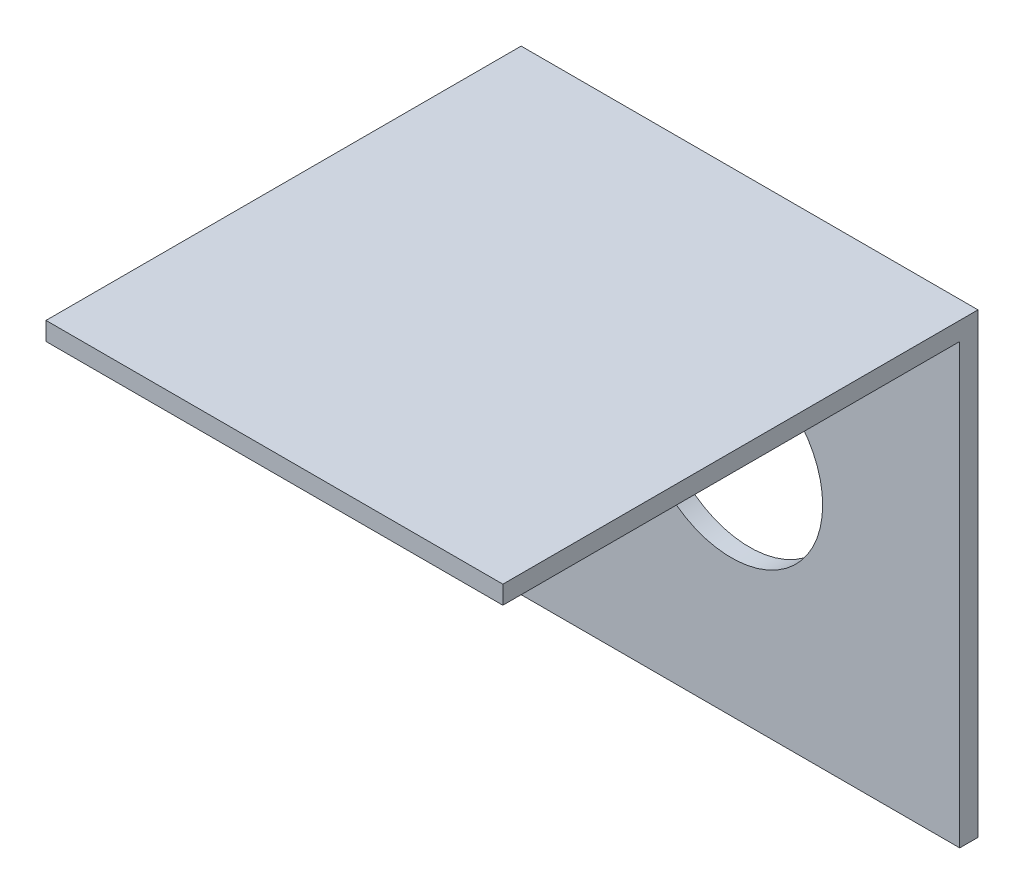
ISO-10303-21;
HEADER;
FILE_DESCRIPTION(('STEP AP214'),'2;1');
FILE_NAME('part.step','',(''),(''),'','','');
FILE_SCHEMA(('AUTOMOTIVE_DESIGN { 1 0 10303 214 1 1 1 1 }'));
ENDSEC;
DATA;
#1=APPLICATION_CONTEXT('core data for automotive mechanical design processes');
#2=APPLICATION_PROTOCOL_DEFINITION('international standard','automotive_design',2000,#1);
#3=PRODUCT_CONTEXT('',#1,'mechanical');
#4=PRODUCT('Part','Part','',(#3));
#5=PRODUCT_RELATED_PRODUCT_CATEGORY('part','',(#4));
#6=PRODUCT_DEFINITION_FORMATION('','',#4);
#7=PRODUCT_DEFINITION_CONTEXT('part definition',#1,'design');
#8=PRODUCT_DEFINITION('design','',#6,#7);
#9=PRODUCT_DEFINITION_SHAPE('','',#8);
#10=(LENGTH_UNIT() NAMED_UNIT(*) SI_UNIT(.MILLI.,.METRE.));
#11=(NAMED_UNIT(*) PLANE_ANGLE_UNIT() SI_UNIT($,.RADIAN.));
#12=(NAMED_UNIT(*) SI_UNIT($,.STERADIAN.) SOLID_ANGLE_UNIT());
#13=UNCERTAINTY_MEASURE_WITH_UNIT(LENGTH_MEASURE(1.E-05),#10,'distance_accuracy_value','');
#14=(GEOMETRIC_REPRESENTATION_CONTEXT(3) GLOBAL_UNCERTAINTY_ASSIGNED_CONTEXT((#13)) GLOBAL_UNIT_ASSIGNED_CONTEXT((#10,
#11,#12)) REPRESENTATION_CONTEXT('',''));
#15=CARTESIAN_POINT('',(0.,0.,0.));
#16=DIRECTION('',(0.,0.,1.));
#17=DIRECTION('',(1.,0.,0.));
#18=AXIS2_PLACEMENT_3D('',#15,#16,#17);
#19=CARTESIAN_POINT('',(0.,0.,2.));
#20=DIRECTION('',(0.,0.,-1.));
#21=DIRECTION('',(-1.,0.,0.));
#22=AXIS2_PLACEMENT_3D('',#19,#20,#21);
#23=PLANE('',#22);
#24=CARTESIAN_POINT('',(0.,0.,2.));
#25=DIRECTION('',(0.,0.,-1.));
#26=DIRECTION('',(-1.,0.,0.));
#27=AXIS2_PLACEMENT_3D('',#24,#25,#26);
#28=CIRCLE('',#27,10.);
#29=CARTESIAN_POINT('',(-10.,0.,2.));
#30=VERTEX_POINT('',#29);
#31=EDGE_CURVE('E136',#30,#30,#28,.T.);
#32=ORIENTED_EDGE('',*,*,#31,.T.);
#33=EDGE_LOOP('',(#32));
#34=FACE_BOUND('',#33,.T.);
#35=DIRECTION('',(1.,0.,0.));
#36=VECTOR('',#35,1.);
#37=CARTESIAN_POINT('',(-25.,23.,2.));
#38=LINE('',#37,#36);
#39=CARTESIAN_POINT('',(-25.,23.,2.));
#40=VERTEX_POINT('',#39);
#41=CARTESIAN_POINT('',(25.,23.,2.));
#42=VERTEX_POINT('',#41);
#43=EDGE_CURVE('E52',#40,#42,#38,.T.);
#44=ORIENTED_EDGE('',*,*,#43,.F.);
#45=DIRECTION('',(0.,-1.,0.));
#46=VECTOR('',#45,1.);
#47=CARTESIAN_POINT('',(-25.,-25.,2.));
#48=LINE('',#47,#46);
#49=CARTESIAN_POINT('',(-25.,-25.,2.));
#50=VERTEX_POINT('',#49);
#51=EDGE_CURVE('E138',#40,#50,#48,.T.);
#52=ORIENTED_EDGE('',*,*,#51,.T.);
#53=DIRECTION('',(1.,0.,0.));
#54=VECTOR('',#53,1.);
#55=CARTESIAN_POINT('',(-25.,-25.,2.));
#56=LINE('',#55,#54);
#57=CARTESIAN_POINT('',(25.,-25.,2.));
#58=VERTEX_POINT('',#57);
#59=EDGE_CURVE('E58',#50,#58,#56,.T.);
#60=ORIENTED_EDGE('',*,*,#59,.T.);
#61=DIRECTION('',(0.,1.,0.));
#62=VECTOR('',#61,1.);
#63=CARTESIAN_POINT('',(25.,-25.,2.));
#64=LINE('',#63,#62);
#65=EDGE_CURVE('E87',#58,#42,#64,.T.);
#66=ORIENTED_EDGE('',*,*,#65,.T.);
#67=EDGE_LOOP('',(#44,#52,#60,#66));
#68=FACE_BOUND('',#67,.T.);
#69=ADVANCED_FACE('F37',(#34,#68),#23,.F.);
#70=CARTESIAN_POINT('',(25.,-25.,2.));
#71=DIRECTION('',(-1.,0.,0.));
#72=DIRECTION('',(0.,0.,1.));
#73=AXIS2_PLACEMENT_3D('',#70,#71,#72);
#74=PLANE('',#73);
#75=DIRECTION('',(0.,1.,0.));
#76=VECTOR('',#75,1.);
#77=CARTESIAN_POINT('',(25.,-25.,0.));
#78=LINE('',#77,#76);
#79=CARTESIAN_POINT('',(25.,-25.,0.));
#80=VERTEX_POINT('',#79);
#81=CARTESIAN_POINT('',(25.,25.,0.));
#82=VERTEX_POINT('',#81);
#83=EDGE_CURVE('E93',#80,#82,#78,.T.);
#84=ORIENTED_EDGE('',*,*,#83,.T.);
#85=DIRECTION('',(0.,0.,-1.));
#86=VECTOR('',#85,1.);
#87=CARTESIAN_POINT('',(25.,25.,2.));
#88=LINE('',#87,#86);
#89=CARTESIAN_POINT('',(25.,25.,52.));
#90=VERTEX_POINT('',#89);
#91=EDGE_CURVE('E11',#90,#82,#88,.T.);
#92=ORIENTED_EDGE('',*,*,#91,.F.);
#93=DIRECTION('',(0.,1.,0.));
#94=VECTOR('',#93,1.);
#95=CARTESIAN_POINT('',(25.,25.,52.));
#96=LINE('',#95,#94);
#97=CARTESIAN_POINT('',(25.,23.,52.));
#98=VERTEX_POINT('',#97);
#99=EDGE_CURVE('E129',#98,#90,#96,.T.);
#100=ORIENTED_EDGE('',*,*,#99,.F.);
#101=DIRECTION('',(0.,0.,-1.));
#102=VECTOR('',#101,1.);
#103=CARTESIAN_POINT('',(25.,23.,52.));
#104=LINE('',#103,#102);
#105=EDGE_CURVE('E102',#98,#42,#104,.T.);
#106=ORIENTED_EDGE('',*,*,#105,.T.);
#107=ORIENTED_EDGE('',*,*,#65,.F.);
#108=DIRECTION('',(0.,0.,-1.));
#109=VECTOR('',#108,1.);
#110=CARTESIAN_POINT('',(25.,-25.,2.));
#111=LINE('',#110,#109);
#112=EDGE_CURVE('E80',#58,#80,#111,.T.);
#113=ORIENTED_EDGE('',*,*,#112,.T.);
#114=EDGE_LOOP('',(#84,#92,#100,#106,#107,#113));
#115=FACE_BOUND('',#114,.T.);
#116=ADVANCED_FACE('F39',(#115),#74,.F.);
#117=CARTESIAN_POINT('',(-25.,25.,2.));
#118=DIRECTION('',(0.,-1.,0.));
#119=DIRECTION('',(0.,0.,-1.));
#120=AXIS2_PLACEMENT_3D('',#117,#118,#119);
#121=PLANE('',#120);
#122=DIRECTION('',(-1.,0.,0.));
#123=VECTOR('',#122,1.);
#124=CARTESIAN_POINT('',(-25.,25.,0.));
#125=LINE('',#124,#123);
#126=CARTESIAN_POINT('',(-25.,25.,0.));
#127=VERTEX_POINT('',#126);
#128=EDGE_CURVE('E97',#82,#127,#125,.T.);
#129=ORIENTED_EDGE('',*,*,#128,.T.);
#130=DIRECTION('',(0.,0.,-1.));
#131=VECTOR('',#130,1.);
#132=CARTESIAN_POINT('',(-25.,25.,2.));
#133=LINE('',#132,#131);
#134=CARTESIAN_POINT('',(-25.,25.,52.));
#135=VERTEX_POINT('',#134);
#136=EDGE_CURVE('E45',#135,#127,#133,.T.);
#137=ORIENTED_EDGE('',*,*,#136,.F.);
#138=DIRECTION('',(-1.,0.,0.));
#139=VECTOR('',#138,1.);
#140=CARTESIAN_POINT('',(-25.,25.,52.));
#141=LINE('',#140,#139);
#142=EDGE_CURVE('E121',#90,#135,#141,.T.);
#143=ORIENTED_EDGE('',*,*,#142,.F.);
#144=ORIENTED_EDGE('',*,*,#91,.T.);
#145=EDGE_LOOP('',(#129,#137,#143,#144));
#146=FACE_BOUND('',#145,.T.);
#147=ADVANCED_FACE('F119',(#146),#121,.F.);
#148=CARTESIAN_POINT('',(-25.,-25.,2.));
#149=DIRECTION('',(1.,0.,0.));
#150=DIRECTION('',(0.,0.,-1.));
#151=AXIS2_PLACEMENT_3D('',#148,#149,#150);
#152=PLANE('',#151);
#153=DIRECTION('',(0.,-1.,0.));
#154=VECTOR('',#153,1.);
#155=CARTESIAN_POINT('',(-25.,-25.,0.));
#156=LINE('',#155,#154);
#157=CARTESIAN_POINT('',(-25.,-25.,0.));
#158=VERTEX_POINT('',#157);
#159=EDGE_CURVE('E88',#127,#158,#156,.T.);
#160=ORIENTED_EDGE('',*,*,#159,.T.);
#161=DIRECTION('',(0.,0.,-1.));
#162=VECTOR('',#161,1.);
#163=CARTESIAN_POINT('',(-25.,-25.,2.));
#164=LINE('',#163,#162);
#165=EDGE_CURVE('E83',#50,#158,#164,.T.);
#166=ORIENTED_EDGE('',*,*,#165,.F.);
#167=ORIENTED_EDGE('',*,*,#51,.F.);
#168=DIRECTION('',(0.,0.,-1.));
#169=VECTOR('',#168,1.);
#170=CARTESIAN_POINT('',(-25.,23.,52.));
#171=LINE('',#170,#169);
#172=CARTESIAN_POINT('',(-25.,23.,52.));
#173=VERTEX_POINT('',#172);
#174=EDGE_CURVE('E98',#173,#40,#171,.T.);
#175=ORIENTED_EDGE('',*,*,#174,.F.);
#176=DIRECTION('',(0.,-1.,0.));
#177=VECTOR('',#176,1.);
#178=CARTESIAN_POINT('',(-25.,25.,52.));
#179=LINE('',#178,#177);
#180=EDGE_CURVE('E115',#135,#173,#179,.T.);
#181=ORIENTED_EDGE('',*,*,#180,.F.);
#182=ORIENTED_EDGE('',*,*,#136,.T.);
#183=EDGE_LOOP('',(#160,#166,#167,#175,#181,#182));
#184=FACE_BOUND('',#183,.T.);
#185=ADVANCED_FACE('F112',(#184),#152,.F.);
#186=CARTESIAN_POINT('',(-25.,-25.,2.));
#187=DIRECTION('',(0.,1.,0.));
#188=DIRECTION('',(0.,0.,1.));
#189=AXIS2_PLACEMENT_3D('',#186,#187,#188);
#190=PLANE('',#189);
#191=DIRECTION('',(1.,0.,0.));
#192=VECTOR('',#191,1.);
#193=CARTESIAN_POINT('',(-25.,-25.,0.));
#194=LINE('',#193,#192);
#195=EDGE_CURVE('E77',#158,#80,#194,.T.);
#196=ORIENTED_EDGE('',*,*,#195,.T.);
#197=ORIENTED_EDGE('',*,*,#112,.F.);
#198=ORIENTED_EDGE('',*,*,#59,.F.);
#199=ORIENTED_EDGE('',*,*,#165,.T.);
#200=EDGE_LOOP('',(#196,#197,#198,#199));
#201=FACE_BOUND('',#200,.T.);
#202=ADVANCED_FACE('F79',(#201),#190,.F.);
#203=CARTESIAN_POINT('',(0.,0.,0.));
#204=DIRECTION('',(0.,0.,-1.));
#205=DIRECTION('',(-1.,0.,0.));
#206=AXIS2_PLACEMENT_3D('',#203,#204,#205);
#207=PLANE('',#206);
#208=CARTESIAN_POINT('',(0.,0.,0.));
#209=DIRECTION('',(0.,0.,-1.));
#210=DIRECTION('',(-1.,0.,0.));
#211=AXIS2_PLACEMENT_3D('',#208,#209,#210);
#212=CIRCLE('',#211,10.);
#213=CARTESIAN_POINT('',(-10.,0.,0.));
#214=VERTEX_POINT('',#213);
#215=EDGE_CURVE('E150',#214,#214,#212,.T.);
#216=ORIENTED_EDGE('',*,*,#215,.F.);
#217=EDGE_LOOP('',(#216));
#218=FACE_BOUND('',#217,.T.);
#219=ORIENTED_EDGE('',*,*,#83,.F.);
#220=ORIENTED_EDGE('',*,*,#195,.F.);
#221=ORIENTED_EDGE('',*,*,#159,.F.);
#222=ORIENTED_EDGE('',*,*,#128,.F.);
#223=EDGE_LOOP('',(#219,#220,#221,#222));
#224=FACE_BOUND('',#223,.T.);
#225=ADVANCED_FACE('F96',(#218,#224),#207,.T.);
#226=CARTESIAN_POINT('',(-25.,23.,52.));
#227=DIRECTION('',(0.,1.,0.));
#228=DIRECTION('',(0.,0.,1.));
#229=AXIS2_PLACEMENT_3D('',#226,#227,#228);
#230=PLANE('',#229);
#231=ORIENTED_EDGE('',*,*,#43,.T.);
#232=ORIENTED_EDGE('',*,*,#105,.F.);
#233=DIRECTION('',(1.,0.,0.));
#234=VECTOR('',#233,1.);
#235=CARTESIAN_POINT('',(-25.,23.,52.));
#236=LINE('',#235,#234);
#237=EDGE_CURVE('E132',#173,#98,#236,.T.);
#238=ORIENTED_EDGE('',*,*,#237,.F.);
#239=ORIENTED_EDGE('',*,*,#174,.T.);
#240=EDGE_LOOP('',(#231,#232,#238,#239));
#241=FACE_BOUND('',#240,.T.);
#242=ADVANCED_FACE('F141',(#241),#230,.F.);
#243=CARTESIAN_POINT('',(0.,0.,52.));
#244=DIRECTION('',(0.,0.,1.));
#245=DIRECTION('',(1.,0.,0.));
#246=AXIS2_PLACEMENT_3D('',#243,#244,#245);
#247=PLANE('',#246);
#248=ORIENTED_EDGE('',*,*,#180,.T.);
#249=ORIENTED_EDGE('',*,*,#237,.T.);
#250=ORIENTED_EDGE('',*,*,#99,.T.);
#251=ORIENTED_EDGE('',*,*,#142,.T.);
#252=EDGE_LOOP('',(#248,#249,#250,#251));
#253=FACE_BOUND('',#252,.T.);
#254=ADVANCED_FACE('F125',(#253),#247,.T.);
#255=CARTESIAN_POINT('',(0.,0.,20.));
#256=DIRECTION('',(0.,0.,-1.));
#257=DIRECTION('',(-1.,0.,0.));
#258=AXIS2_PLACEMENT_3D('',#255,#256,#257);
#259=CYLINDRICAL_SURFACE('',#258,10.);
#260=ORIENTED_EDGE('',*,*,#215,.T.);
#261=EDGE_LOOP('',(#260));
#262=FACE_BOUND('',#261,.T.);
#263=ORIENTED_EDGE('',*,*,#31,.F.);
#264=EDGE_LOOP('',(#263));
#265=FACE_BOUND('',#264,.T.);
#266=ADVANCED_FACE('F154',(#262,#265),#259,.F.);
#267=CLOSED_SHELL('',(#69,#116,#147,#185,#202,#225,#242,#254,#266));
#268=MANIFOLD_SOLID_BREP('B2',#267);
#269=ADVANCED_BREP_SHAPE_REPRESENTATION('',(#18,#268),#14);
#270=SHAPE_DEFINITION_REPRESENTATION(#9,#269);
ENDSEC;
END-ISO-10303-21;
